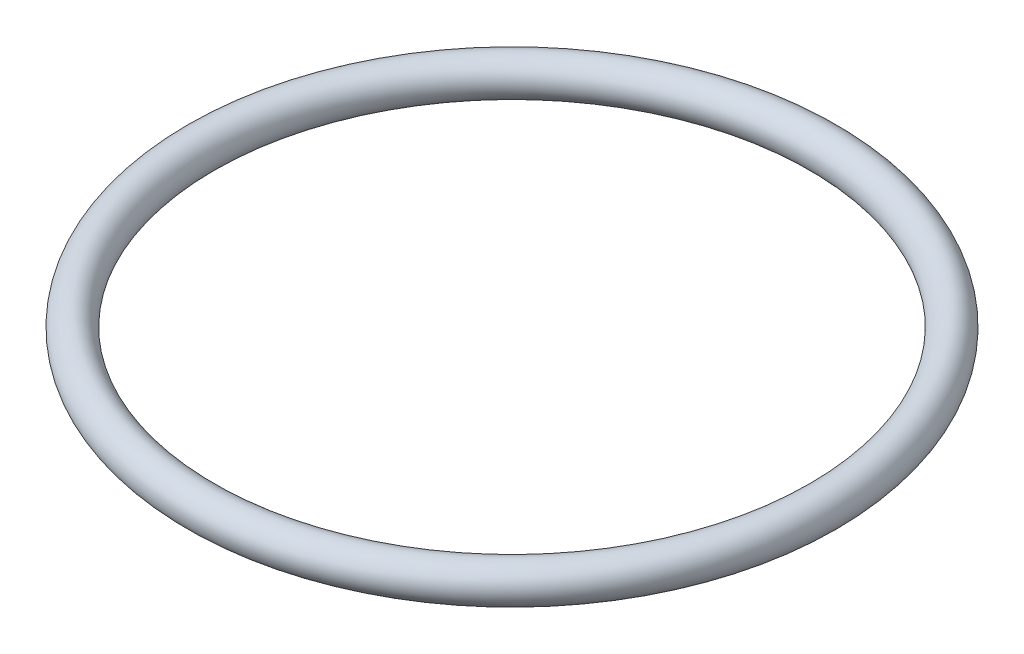
ISO-10303-21;
HEADER;
FILE_DESCRIPTION(('STEP AP214'),'2;1');
FILE_NAME('part.step','',(''),(''),'','','');
FILE_SCHEMA(('AUTOMOTIVE_DESIGN { 1 0 10303 214 1 1 1 1 }'));
ENDSEC;
DATA;
#1=APPLICATION_CONTEXT('core data for automotive mechanical design processes');
#2=APPLICATION_PROTOCOL_DEFINITION('international standard','automotive_design',2000,#1);
#3=PRODUCT_CONTEXT('',#1,'mechanical');
#4=PRODUCT('Part','Part','',(#3));
#5=PRODUCT_RELATED_PRODUCT_CATEGORY('part','',(#4));
#6=PRODUCT_DEFINITION_FORMATION('','',#4);
#7=PRODUCT_DEFINITION_CONTEXT('part definition',#1,'design');
#8=PRODUCT_DEFINITION('design','',#6,#7);
#9=PRODUCT_DEFINITION_SHAPE('','',#8);
#10=(LENGTH_UNIT() NAMED_UNIT(*) SI_UNIT(.MILLI.,.METRE.));
#11=(NAMED_UNIT(*) PLANE_ANGLE_UNIT() SI_UNIT($,.RADIAN.));
#12=(NAMED_UNIT(*) SI_UNIT($,.STERADIAN.) SOLID_ANGLE_UNIT());
#13=UNCERTAINTY_MEASURE_WITH_UNIT(LENGTH_MEASURE(1.E-05),#10,'distance_accuracy_value','');
#14=(GEOMETRIC_REPRESENTATION_CONTEXT(3) GLOBAL_UNCERTAINTY_ASSIGNED_CONTEXT((#13)) GLOBAL_UNIT_ASSIGNED_CONTEXT((#10,
#11,#12)) REPRESENTATION_CONTEXT('',''));
#15=CARTESIAN_POINT('',(0.,0.,0.));
#16=DIRECTION('',(0.,0.,1.));
#17=DIRECTION('',(1.,0.,0.));
#18=AXIS2_PLACEMENT_3D('',#15,#16,#17);
#19=CARTESIAN_POINT('',(0.,0.,0.));
#20=DIRECTION('',(0.,1.,0.));
#21=DIRECTION('',(0.,0.,1.));
#22=AXIS2_PLACEMENT_3D('',#19,#20,#21);
#23=TOROIDAL_SURFACE('',#22,52.9375,3.17500000000001);
#24=CARTESIAN_POINT('',(-52.9375,0.,0.));
#25=DIRECTION('',(0.,0.,1.));
#26=DIRECTION('',(1.,0.,0.));
#27=AXIS2_PLACEMENT_3D('',#24,#25,#26);
#28=CIRCLE('',#27,3.17500000000001);
#29=CARTESIAN_POINT('',(-56.1125,0.,0.));
#30=VERTEX_POINT('',#29);
#31=EDGE_CURVE('E10',#30,#30,#28,.T.);
#32=CARTESIAN_POINT('',(0.,0.,0.));
#33=DIRECTION('',(0.,1.,0.));
#34=DIRECTION('',(0.,0.,1.));
#35=AXIS2_PLACEMENT_3D('',#32,#33,#34);
#36=CIRCLE('',#35,56.1125);
#37=EDGE_CURVE('',#30,#30,#36,.T.);
#38=ORIENTED_EDGE('',*,*,#31,.T.);
#39=ORIENTED_EDGE('',*,*,#31,.F.);
#40=ORIENTED_EDGE('',*,*,#37,.T.);
#41=ORIENTED_EDGE('',*,*,#37,.F.);
#42=EDGE_LOOP('',(#38,#40,#39,#41));
#43=FACE_BOUND('',#42,.T.);
#44=ADVANCED_FACE('F30',(#43),#23,.T.);
#45=CLOSED_SHELL('',(#44));
#46=MANIFOLD_SOLID_BREP('B2',#45);
#47=ADVANCED_BREP_SHAPE_REPRESENTATION('',(#18,#46),#14);
#48=SHAPE_DEFINITION_REPRESENTATION(#9,#47);
ENDSEC;
END-ISO-10303-21;
